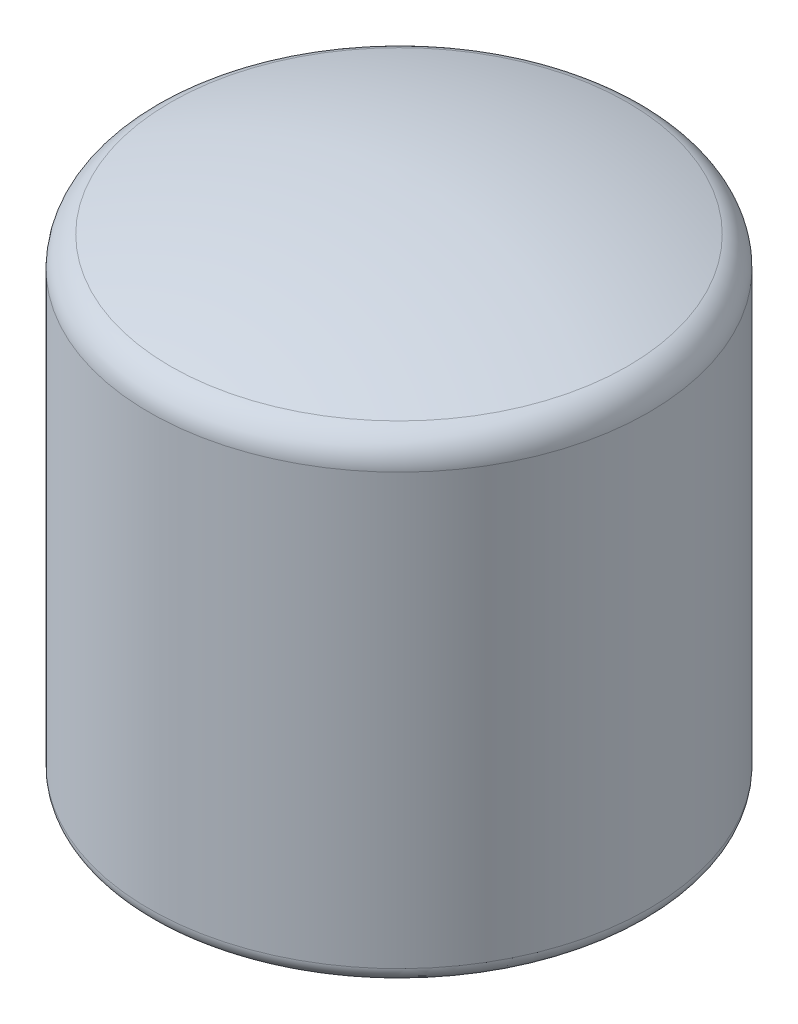
ISO-10303-21;
HEADER;
FILE_DESCRIPTION(('STEP AP214'),'2;1');
FILE_NAME('part.step','',(''),(''),'','','');
FILE_SCHEMA(('AUTOMOTIVE_DESIGN { 1 0 10303 214 1 1 1 1 }'));
ENDSEC;
DATA;
#1=APPLICATION_CONTEXT('core data for automotive mechanical design processes');
#2=APPLICATION_PROTOCOL_DEFINITION('international standard','automotive_design',2000,#1);
#3=PRODUCT_CONTEXT('',#1,'mechanical');
#4=PRODUCT('Part','Part','',(#3));
#5=PRODUCT_RELATED_PRODUCT_CATEGORY('part','',(#4));
#6=PRODUCT_DEFINITION_FORMATION('','',#4);
#7=PRODUCT_DEFINITION_CONTEXT('part definition',#1,'design');
#8=PRODUCT_DEFINITION('design','',#6,#7);
#9=PRODUCT_DEFINITION_SHAPE('','',#8);
#10=(LENGTH_UNIT() NAMED_UNIT(*) SI_UNIT(.MILLI.,.METRE.));
#11=(NAMED_UNIT(*) PLANE_ANGLE_UNIT() SI_UNIT($,.RADIAN.));
#12=(NAMED_UNIT(*) SI_UNIT($,.STERADIAN.) SOLID_ANGLE_UNIT());
#13=UNCERTAINTY_MEASURE_WITH_UNIT(LENGTH_MEASURE(1.E-05),#10,'distance_accuracy_value','');
#14=(GEOMETRIC_REPRESENTATION_CONTEXT(3) GLOBAL_UNCERTAINTY_ASSIGNED_CONTEXT((#13)) GLOBAL_UNIT_ASSIGNED_CONTEXT((#10,
#11,#12)) REPRESENTATION_CONTEXT('',''));
#15=CARTESIAN_POINT('',(0.,0.,0.));
#16=DIRECTION('',(0.,0.,1.));
#17=DIRECTION('',(1.,0.,0.));
#18=AXIS2_PLACEMENT_3D('',#15,#16,#17);
#19=CARTESIAN_POINT('',(1.68530368415994E-13,-12.1,0.));
#20=DIRECTION('',(0.,-1.,0.));
#21=DIRECTION('',(-1.,0.,0.));
#22=AXIS2_PLACEMENT_3D('',#19,#20,#21);
#23=SPHERICAL_SURFACE('',#22,45.);
#24=CARTESIAN_POINT('',(1.69053066167588E-13,30.4481307330942,0.));
#25=DIRECTION('',(0.,-1.,0.));
#26=DIRECTION('',(1.,0.,0.));
#27=AXIS2_PLACEMENT_3D('',#24,#25,#26);
#28=CIRCLE('',#27,14.6511627906977);
#29=CARTESIAN_POINT('',(14.6511627906978,30.4481307330942,0.));
#30=VERTEX_POINT('',#29);
#31=EDGE_CURVE('E49',#30,#30,#28,.F.);
#32=ORIENTED_EDGE('',*,*,#31,.T.);
#33=EDGE_LOOP('',(#32));
#34=FACE_BOUND('',#33,.T.);
#35=ADVANCED_FACE('F38',(#34),#23,.T.);
#36=CARTESIAN_POINT('',(-12.5,28.9,0.));
#37=DIRECTION('',(0.,1.,0.));
#38=DIRECTION('',(-1.,0.,0.));
#39=AXIS2_PLACEMENT_3D('',#36,#37,#38);
#40=PLANE('',#39);
#41=CARTESIAN_POINT('',(0.,28.9,0.));
#42=DIRECTION('',(0.,-1.,0.));
#43=DIRECTION('',(1.,0.,0.));
#44=AXIS2_PLACEMENT_3D('',#41,#42,#43);
#45=CIRCLE('',#44,12.5);
#46=CARTESIAN_POINT('',(12.5,28.9,0.));
#47=VERTEX_POINT('',#46);
#48=EDGE_CURVE('E58',#47,#47,#45,.T.);
#49=ORIENTED_EDGE('',*,*,#48,.T.);
#50=EDGE_LOOP('',(#49));
#51=FACE_BOUND('',#50,.T.);
#52=ADVANCED_FACE('F99',(#51),#40,.F.);
#53=CARTESIAN_POINT('',(0.,0.,0.));
#54=DIRECTION('',(0.,-1.,0.));
#55=DIRECTION('',(1.,0.,0.));
#56=AXIS2_PLACEMENT_3D('',#53,#54,#55);
#57=CYLINDRICAL_SURFACE('',#56,12.5);
#58=ORIENTED_EDGE('',*,*,#48,.F.);
#59=EDGE_LOOP('',(#58));
#60=FACE_BOUND('',#59,.T.);
#61=CARTESIAN_POINT('',(0.,9.3,0.));
#62=DIRECTION('',(0.,-1.,0.));
#63=DIRECTION('',(1.,0.,0.));
#64=AXIS2_PLACEMENT_3D('',#61,#62,#63);
#65=CIRCLE('',#64,12.5);
#66=CARTESIAN_POINT('',(12.5,9.3,0.));
#67=VERTEX_POINT('',#66);
#68=EDGE_CURVE('E61',#67,#67,#65,.T.);
#69=ORIENTED_EDGE('',*,*,#68,.T.);
#70=EDGE_LOOP('',(#69));
#71=FACE_BOUND('',#70,.T.);
#72=ADVANCED_FACE('F105',(#60,#71),#57,.F.);
#73=CARTESIAN_POINT('',(-9.,9.3,0.));
#74=DIRECTION('',(0.,-1.,0.));
#75=DIRECTION('',(1.,0.,0.));
#76=AXIS2_PLACEMENT_3D('',#73,#74,#75);
#77=PLANE('',#76);
#78=ORIENTED_EDGE('',*,*,#68,.F.);
#79=EDGE_LOOP('',(#78));
#80=FACE_BOUND('',#79,.T.);
#81=CARTESIAN_POINT('',(0.,9.3,0.));
#82=DIRECTION('',(0.,-1.,0.));
#83=DIRECTION('',(1.,0.,0.));
#84=AXIS2_PLACEMENT_3D('',#81,#82,#83);
#85=CIRCLE('',#84,9.);
#86=CARTESIAN_POINT('',(9.,9.3,0.));
#87=VERTEX_POINT('',#86);
#88=EDGE_CURVE('E64',#87,#87,#85,.T.);
#89=ORIENTED_EDGE('',*,*,#88,.T.);
#90=EDGE_LOOP('',(#89));
#91=FACE_BOUND('',#90,.T.);
#92=ADVANCED_FACE('F195',(#80,#91),#77,.F.);
#93=CARTESIAN_POINT('',(0.,0.,0.));
#94=DIRECTION('',(0.,-1.,0.));
#95=DIRECTION('',(1.,0.,0.));
#96=AXIS2_PLACEMENT_3D('',#93,#94,#95);
#97=CYLINDRICAL_SURFACE('',#96,9.);
#98=ORIENTED_EDGE('',*,*,#88,.F.);
#99=EDGE_LOOP('',(#98));
#100=FACE_BOUND('',#99,.T.);
#101=CARTESIAN_POINT('',(0.,6.3,0.));
#102=DIRECTION('',(0.,-1.,0.));
#103=DIRECTION('',(1.,0.,0.));
#104=AXIS2_PLACEMENT_3D('',#101,#102,#103);
#105=CIRCLE('',#104,9.);
#106=CARTESIAN_POINT('',(9.,6.3,0.));
#107=VERTEX_POINT('',#106);
#108=EDGE_CURVE('E67',#107,#107,#105,.T.);
#109=ORIENTED_EDGE('',*,*,#108,.T.);
#110=EDGE_LOOP('',(#109));
#111=FACE_BOUND('',#110,.T.);
#112=ADVANCED_FACE('F184',(#100,#111),#97,.F.);
#113=CARTESIAN_POINT('',(-12.5,6.3,0.));
#114=DIRECTION('',(0.,1.,0.));
#115=DIRECTION('',(-1.,0.,0.));
#116=AXIS2_PLACEMENT_3D('',#113,#114,#115);
#117=PLANE('',#116);
#118=ORIENTED_EDGE('',*,*,#108,.F.);
#119=EDGE_LOOP('',(#118));
#120=FACE_BOUND('',#119,.T.);
#121=CARTESIAN_POINT('',(0.,6.3,0.));
#122=DIRECTION('',(0.,-1.,0.));
#123=DIRECTION('',(1.,0.,0.));
#124=AXIS2_PLACEMENT_3D('',#121,#122,#123);
#125=CIRCLE('',#124,12.5);
#126=CARTESIAN_POINT('',(12.5,6.3,0.));
#127=VERTEX_POINT('',#126);
#128=EDGE_CURVE('E70',#127,#127,#125,.T.);
#129=ORIENTED_EDGE('',*,*,#128,.T.);
#130=EDGE_LOOP('',(#129));
#131=FACE_BOUND('',#130,.T.);
#132=ADVANCED_FACE('F173',(#120,#131),#117,.F.);
#133=CARTESIAN_POINT('',(0.,0.,0.));
#134=DIRECTION('',(0.,-1.,0.));
#135=DIRECTION('',(1.,0.,0.));
#136=AXIS2_PLACEMENT_3D('',#133,#134,#135);
#137=CYLINDRICAL_SURFACE('',#136,12.5);
#138=ORIENTED_EDGE('',*,*,#128,.F.);
#139=EDGE_LOOP('',(#138));
#140=FACE_BOUND('',#139,.T.);
#141=CARTESIAN_POINT('',(0.,3.,0.));
#142=DIRECTION('',(0.,-1.,0.));
#143=DIRECTION('',(1.,0.,0.));
#144=AXIS2_PLACEMENT_3D('',#141,#142,#143);
#145=CIRCLE('',#144,12.5);
#146=CARTESIAN_POINT('',(12.5,3.,0.));
#147=VERTEX_POINT('',#146);
#148=EDGE_CURVE('E73',#147,#147,#145,.T.);
#149=ORIENTED_EDGE('',*,*,#148,.T.);
#150=EDGE_LOOP('',(#149));
#151=FACE_BOUND('',#150,.T.);
#152=ADVANCED_FACE('F162',(#140,#151),#137,.F.);
#153=CARTESIAN_POINT('',(-12.5,3.,0.));
#154=DIRECTION('',(0.,-1.,0.));
#155=DIRECTION('',(1.,0.,0.));
#156=AXIS2_PLACEMENT_3D('',#153,#154,#155);
#157=PLANE('',#156);
#158=ORIENTED_EDGE('',*,*,#148,.F.);
#159=EDGE_LOOP('',(#158));
#160=FACE_BOUND('',#159,.T.);
#161=CARTESIAN_POINT('',(0.,3.,0.));
#162=DIRECTION('',(0.,-1.,0.));
#163=DIRECTION('',(1.,0.,0.));
#164=AXIS2_PLACEMENT_3D('',#161,#162,#163);
#165=CIRCLE('',#164,9.);
#166=CARTESIAN_POINT('',(9.,3.,0.));
#167=VERTEX_POINT('',#166);
#168=EDGE_CURVE('E76',#167,#167,#165,.T.);
#169=ORIENTED_EDGE('',*,*,#168,.T.);
#170=EDGE_LOOP('',(#169));
#171=FACE_BOUND('',#170,.T.);
#172=ADVANCED_FACE('F95',(#160,#171),#157,.F.);
#173=CARTESIAN_POINT('',(0.,0.,0.));
#174=DIRECTION('',(0.,-1.,0.));
#175=DIRECTION('',(1.,0.,0.));
#176=AXIS2_PLACEMENT_3D('',#173,#174,#175);
#177=CYLINDRICAL_SURFACE('',#176,9.);
#178=ORIENTED_EDGE('',*,*,#168,.F.);
#179=EDGE_LOOP('',(#178));
#180=FACE_BOUND('',#179,.T.);
#181=CARTESIAN_POINT('',(0.,0.,0.));
#182=DIRECTION('',(0.,-1.,0.));
#183=DIRECTION('',(1.,0.,0.));
#184=AXIS2_PLACEMENT_3D('',#181,#182,#183);
#185=CIRCLE('',#184,9.);
#186=CARTESIAN_POINT('',(9.,0.,0.));
#187=VERTEX_POINT('',#186);
#188=EDGE_CURVE('E79',#187,#187,#185,.T.);
#189=ORIENTED_EDGE('',*,*,#188,.T.);
#190=EDGE_LOOP('',(#189));
#191=FACE_BOUND('',#190,.T.);
#192=ADVANCED_FACE('F83',(#180,#191),#177,.F.);
#193=CARTESIAN_POINT('',(-16.,0.,0.));
#194=DIRECTION('',(0.,1.,0.));
#195=DIRECTION('',(-1.,0.,0.));
#196=AXIS2_PLACEMENT_3D('',#193,#194,#195);
#197=PLANE('',#196);
#198=CARTESIAN_POINT('',(0.,0.,0.));
#199=DIRECTION('',(0.,1.,0.));
#200=DIRECTION('',(-1.,0.,0.));
#201=AXIS2_PLACEMENT_3D('',#198,#199,#200);
#202=CIRCLE('',#201,15.);
#203=CARTESIAN_POINT('',(-15.,0.,0.));
#204=VERTEX_POINT('',#203);
#205=EDGE_CURVE('E45',#204,#204,#202,.F.);
#206=ORIENTED_EDGE('',*,*,#205,.T.);
#207=EDGE_LOOP('',(#206));
#208=FACE_BOUND('',#207,.T.);
#209=ORIENTED_EDGE('',*,*,#188,.F.);
#210=EDGE_LOOP('',(#209));
#211=FACE_BOUND('',#210,.T.);
#212=ADVANCED_FACE('F85',(#208,#211),#197,.F.);
#213=CARTESIAN_POINT('',(0.,0.,0.));
#214=DIRECTION('',(0.,-1.,0.));
#215=DIRECTION('',(1.,0.,0.));
#216=AXIS2_PLACEMENT_3D('',#213,#214,#215);
#217=CYLINDRICAL_SURFACE('',#216,16.);
#218=CARTESIAN_POINT('',(0.,0.999999999999999,0.));
#219=DIRECTION('',(0.,1.,0.));
#220=DIRECTION('',(-1.,0.,0.));
#221=AXIS2_PLACEMENT_3D('',#218,#219,#220);
#222=CIRCLE('',#221,16.);
#223=CARTESIAN_POINT('',(-16.,0.999999999999999,0.));
#224=VERTEX_POINT('',#223);
#225=EDGE_CURVE('E10',#224,#224,#222,.T.);
#226=ORIENTED_EDGE('',*,*,#225,.T.);
#227=EDGE_LOOP('',(#226));
#228=FACE_BOUND('',#227,.T.);
#229=CARTESIAN_POINT('',(0.,28.5571027005122,0.));
#230=DIRECTION('',(0.,-1.,0.));
#231=DIRECTION('',(1.,0.,0.));
#232=AXIS2_PLACEMENT_3D('',#229,#230,#231);
#233=CIRCLE('',#232,16.);
#234=CARTESIAN_POINT('',(16.,28.5571027005122,0.));
#235=VERTEX_POINT('',#234);
#236=EDGE_CURVE('E53',#235,#235,#233,.T.);
#237=ORIENTED_EDGE('',*,*,#236,.T.);
#238=EDGE_LOOP('',(#237));
#239=FACE_BOUND('',#238,.T.);
#240=ADVANCED_FACE('F87',(#228,#239),#217,.T.);
#241=CARTESIAN_POINT('',(0.,28.5571027005122,0.));
#242=DIRECTION('',(0.,-1.,0.));
#243=DIRECTION('',(1.,0.,0.));
#244=AXIS2_PLACEMENT_3D('',#241,#242,#243);
#245=TOROIDAL_SURFACE('',#244,14.,2.);
#246=ORIENTED_EDGE('',*,*,#31,.F.);
#247=EDGE_LOOP('',(#246));
#248=FACE_BOUND('',#247,.T.);
#249=ORIENTED_EDGE('',*,*,#236,.F.);
#250=EDGE_LOOP('',(#249));
#251=FACE_BOUND('',#250,.T.);
#252=ADVANCED_FACE('F93',(#248,#251),#245,.T.);
#253=CARTESIAN_POINT('',(0.,0.999999999999999,0.));
#254=DIRECTION('',(0.,1.,0.));
#255=DIRECTION('',(-1.,0.,0.));
#256=AXIS2_PLACEMENT_3D('',#253,#254,#255);
#257=TOROIDAL_SURFACE('',#256,15.,1.);
#258=ORIENTED_EDGE('',*,*,#225,.F.);
#259=EDGE_LOOP('',(#258));
#260=FACE_BOUND('',#259,.T.);
#261=ORIENTED_EDGE('',*,*,#205,.F.);
#262=EDGE_LOOP('',(#261));
#263=FACE_BOUND('',#262,.T.);
#264=ADVANCED_FACE('F40',(#260,#263),#257,.T.);
#265=CLOSED_SHELL('',(#35,#52,#72,#92,#112,#132,#152,#172,#192,#212,#240,#252,#264));
#266=MANIFOLD_SOLID_BREP('B2',#265);
#267=ADVANCED_BREP_SHAPE_REPRESENTATION('',(#18,#266),#14);
#268=SHAPE_DEFINITION_REPRESENTATION(#9,#267);
ENDSEC;
END-ISO-10303-21;
